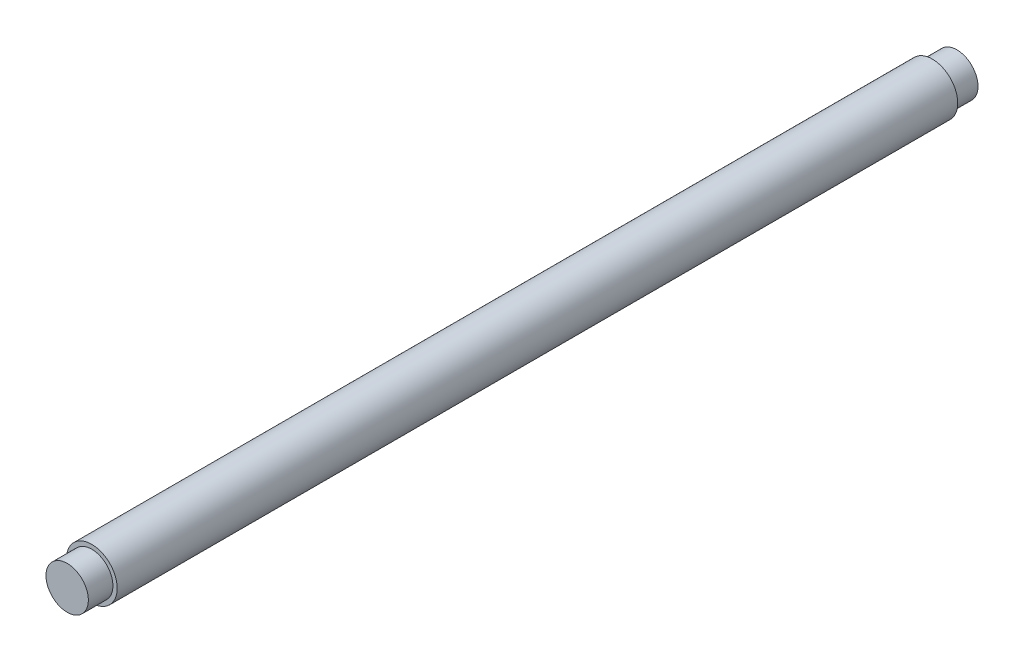
ISO-10303-21;
HEADER;
FILE_DESCRIPTION(('STEP AP214'),'2;1');
FILE_NAME('part.step','',(''),(''),'','','');
FILE_SCHEMA(('AUTOMOTIVE_DESIGN { 1 0 10303 214 1 1 1 1 }'));
ENDSEC;
DATA;
#1=APPLICATION_CONTEXT('core data for automotive mechanical design processes');
#2=APPLICATION_PROTOCOL_DEFINITION('international standard','automotive_design',2000,#1);
#3=PRODUCT_CONTEXT('',#1,'mechanical');
#4=PRODUCT('Part','Part','',(#3));
#5=PRODUCT_RELATED_PRODUCT_CATEGORY('part','',(#4));
#6=PRODUCT_DEFINITION_FORMATION('','',#4);
#7=PRODUCT_DEFINITION_CONTEXT('part definition',#1,'design');
#8=PRODUCT_DEFINITION('design','',#6,#7);
#9=PRODUCT_DEFINITION_SHAPE('','',#8);
#10=(LENGTH_UNIT() NAMED_UNIT(*) SI_UNIT(.MILLI.,.METRE.));
#11=(NAMED_UNIT(*) PLANE_ANGLE_UNIT() SI_UNIT($,.RADIAN.));
#12=(NAMED_UNIT(*) SI_UNIT($,.STERADIAN.) SOLID_ANGLE_UNIT());
#13=UNCERTAINTY_MEASURE_WITH_UNIT(LENGTH_MEASURE(1.E-05),#10,'distance_accuracy_value','');
#14=(GEOMETRIC_REPRESENTATION_CONTEXT(3) GLOBAL_UNCERTAINTY_ASSIGNED_CONTEXT((#13)) GLOBAL_UNIT_ASSIGNED_CONTEXT((#10,
#11,#12)) REPRESENTATION_CONTEXT('',''));
#15=CARTESIAN_POINT('',(0.,0.,0.));
#16=DIRECTION('',(0.,0.,1.));
#17=DIRECTION('',(1.,0.,0.));
#18=AXIS2_PLACEMENT_3D('',#15,#16,#17);
#19=CARTESIAN_POINT('',(0.,0.,105.));
#20=DIRECTION('',(0.,0.,-1.));
#21=DIRECTION('',(-1.,0.,0.));
#22=AXIS2_PLACEMENT_3D('',#19,#20,#21);
#23=CYLINDRICAL_SURFACE('',#22,6.);
#24=CARTESIAN_POINT('',(0.,0.,-99.2));
#25=DIRECTION('',(0.,0.,-1.));
#26=DIRECTION('',(-1.,0.,0.));
#27=AXIS2_PLACEMENT_3D('',#24,#25,#26);
#28=CIRCLE('',#27,6.);
#29=CARTESIAN_POINT('',(-6.,0.,-99.2));
#30=VERTEX_POINT('',#29);
#31=EDGE_CURVE('E10',#30,#30,#28,.T.);
#32=ORIENTED_EDGE('',*,*,#31,.F.);
#33=EDGE_LOOP('',(#32));
#34=FACE_BOUND('',#33,.T.);
#35=CARTESIAN_POINT('',(0.,0.,99.2));
#36=DIRECTION('',(0.,0.,-1.));
#37=DIRECTION('',(-1.,0.,0.));
#38=AXIS2_PLACEMENT_3D('',#35,#36,#37);
#39=CIRCLE('',#38,6.);
#40=CARTESIAN_POINT('',(-6.,0.,99.2));
#41=VERTEX_POINT('',#40);
#42=EDGE_CURVE('E55',#41,#41,#39,.T.);
#43=ORIENTED_EDGE('',*,*,#42,.T.);
#44=EDGE_LOOP('',(#43));
#45=FACE_BOUND('',#44,.T.);
#46=ADVANCED_FACE('F37',(#34,#45),#23,.T.);
#47=CARTESIAN_POINT('',(0.,0.,-99.2));
#48=DIRECTION('',(0.,0.,-1.));
#49=DIRECTION('',(-1.,0.,0.));
#50=AXIS2_PLACEMENT_3D('',#47,#48,#49);
#51=PLANE('',#50);
#52=CARTESIAN_POINT('',(0.,0.,-99.2));
#53=DIRECTION('',(0.,0.,-1.));
#54=DIRECTION('',(-1.,0.,0.));
#55=AXIS2_PLACEMENT_3D('',#52,#53,#54);
#56=CIRCLE('',#55,5.);
#57=CARTESIAN_POINT('',(-5.,0.,-99.2));
#58=VERTEX_POINT('',#57);
#59=EDGE_CURVE('E44',#58,#58,#56,.T.);
#60=ORIENTED_EDGE('',*,*,#59,.F.);
#61=EDGE_LOOP('',(#60));
#62=FACE_BOUND('',#61,.T.);
#63=ORIENTED_EDGE('',*,*,#31,.T.);
#64=EDGE_LOOP('',(#63));
#65=FACE_BOUND('',#64,.T.);
#66=ADVANCED_FACE('F84',(#62,#65),#51,.T.);
#67=CARTESIAN_POINT('',(0.,0.,-99.2));
#68=DIRECTION('',(0.,0.,-1.));
#69=DIRECTION('',(-1.,0.,0.));
#70=AXIS2_PLACEMENT_3D('',#67,#68,#69);
#71=CYLINDRICAL_SURFACE('',#70,5.);
#72=ORIENTED_EDGE('',*,*,#59,.T.);
#73=EDGE_LOOP('',(#72));
#74=FACE_BOUND('',#73,.T.);
#75=CARTESIAN_POINT('',(0.,0.,-105.));
#76=DIRECTION('',(0.,0.,-1.));
#77=DIRECTION('',(-1.,0.,0.));
#78=AXIS2_PLACEMENT_3D('',#75,#76,#77);
#79=CIRCLE('',#78,5.);
#80=CARTESIAN_POINT('',(-5.,0.,-105.));
#81=VERTEX_POINT('',#80);
#82=EDGE_CURVE('E49',#81,#81,#79,.T.);
#83=ORIENTED_EDGE('',*,*,#82,.F.);
#84=EDGE_LOOP('',(#83));
#85=FACE_BOUND('',#84,.T.);
#86=ADVANCED_FACE('F89',(#74,#85),#71,.T.);
#87=CARTESIAN_POINT('',(0.,0.,-105.));
#88=DIRECTION('',(0.,0.,1.));
#89=DIRECTION('',(1.,0.,0.));
#90=AXIS2_PLACEMENT_3D('',#87,#88,#89);
#91=PLANE('',#90);
#92=ORIENTED_EDGE('',*,*,#82,.T.);
#93=EDGE_LOOP('',(#92));
#94=FACE_BOUND('',#93,.T.);
#95=ADVANCED_FACE('F95',(#94),#91,.F.);
#96=CARTESIAN_POINT('',(0.,0.,99.2));
#97=DIRECTION('',(0.,0.,1.));
#98=DIRECTION('',(-1.,0.,0.));
#99=AXIS2_PLACEMENT_3D('',#96,#97,#98);
#100=PLANE('',#99);
#101=ORIENTED_EDGE('',*,*,#42,.F.);
#102=EDGE_LOOP('',(#101));
#103=FACE_BOUND('',#102,.T.);
#104=CARTESIAN_POINT('',(0.,0.,99.2));
#105=DIRECTION('',(0.,0.,-1.));
#106=DIRECTION('',(-1.,0.,0.));
#107=AXIS2_PLACEMENT_3D('',#104,#105,#106);
#108=CIRCLE('',#107,5.);
#109=CARTESIAN_POINT('',(-5.,0.,99.2));
#110=VERTEX_POINT('',#109);
#111=EDGE_CURVE('E60',#110,#110,#108,.T.);
#112=ORIENTED_EDGE('',*,*,#111,.T.);
#113=EDGE_LOOP('',(#112));
#114=FACE_BOUND('',#113,.T.);
#115=ADVANCED_FACE('F69',(#103,#114),#100,.T.);
#116=CARTESIAN_POINT('',(0.,0.,99.2));
#117=DIRECTION('',(0.,0.,1.));
#118=DIRECTION('',(1.,0.,0.));
#119=AXIS2_PLACEMENT_3D('',#116,#117,#118);
#120=CYLINDRICAL_SURFACE('',#119,5.);
#121=ORIENTED_EDGE('',*,*,#111,.F.);
#122=EDGE_LOOP('',(#121));
#123=FACE_BOUND('',#122,.T.);
#124=CARTESIAN_POINT('',(0.,0.,105.));
#125=DIRECTION('',(0.,0.,-1.));
#126=DIRECTION('',(-1.,0.,0.));
#127=AXIS2_PLACEMENT_3D('',#124,#125,#126);
#128=CIRCLE('',#127,5.);
#129=CARTESIAN_POINT('',(-5.,0.,105.));
#130=VERTEX_POINT('',#129);
#131=EDGE_CURVE('E61',#130,#130,#128,.T.);
#132=ORIENTED_EDGE('',*,*,#131,.T.);
#133=EDGE_LOOP('',(#132));
#134=FACE_BOUND('',#133,.T.);
#135=ADVANCED_FACE('F71',(#123,#134),#120,.T.);
#136=CARTESIAN_POINT('',(0.,0.,105.));
#137=DIRECTION('',(0.,0.,1.));
#138=DIRECTION('',(1.,0.,0.));
#139=AXIS2_PLACEMENT_3D('',#136,#137,#138);
#140=PLANE('',#139);
#141=ORIENTED_EDGE('',*,*,#131,.F.);
#142=EDGE_LOOP('',(#141));
#143=FACE_BOUND('',#142,.T.);
#144=ADVANCED_FACE('F74',(#143),#140,.T.);
#145=CLOSED_SHELL('',(#46,#66,#86,#95,#115,#135,#144));
#146=MANIFOLD_SOLID_BREP('B2',#145);
#147=ADVANCED_BREP_SHAPE_REPRESENTATION('',(#18,#146),#14);
#148=SHAPE_DEFINITION_REPRESENTATION(#9,#147);
ENDSEC;
END-ISO-10303-21;
